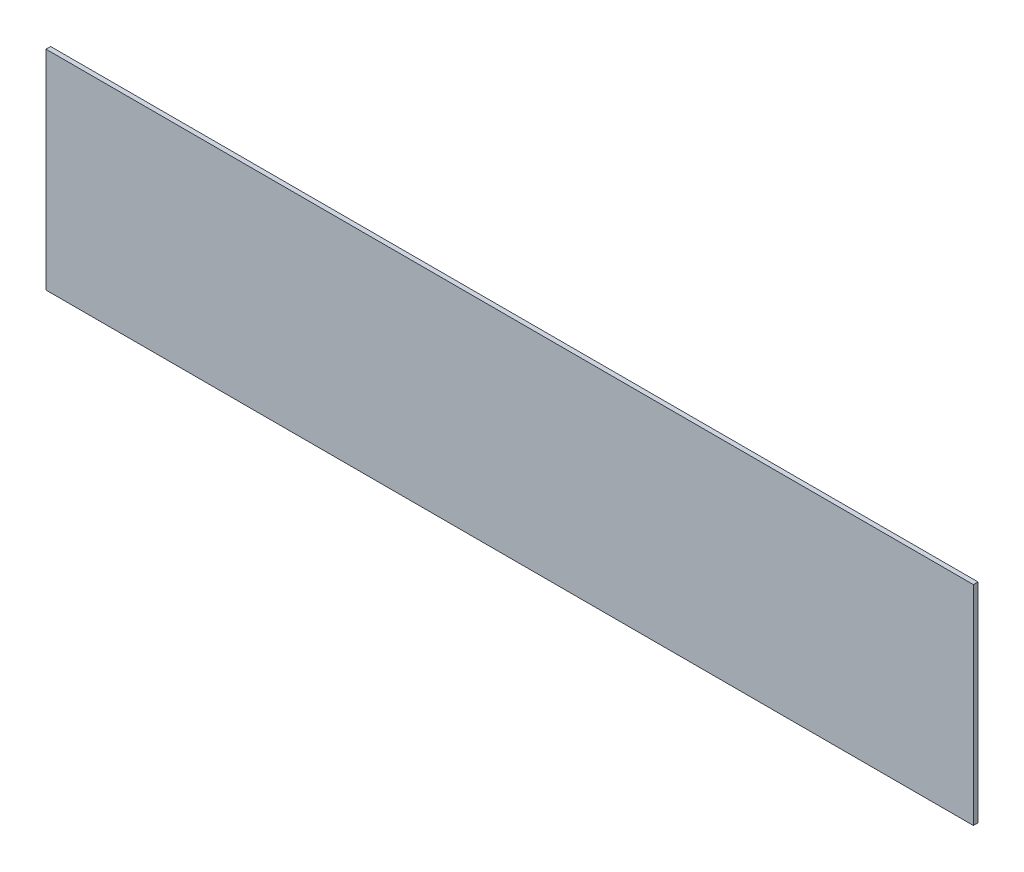
ISO-10303-21;
HEADER;
FILE_DESCRIPTION(('STEP AP214'),'2;1');
FILE_NAME('part.step','',(''),(''),'','','');
FILE_SCHEMA(('AUTOMOTIVE_DESIGN { 1 0 10303 214 1 1 1 1 }'));
ENDSEC;
DATA;
#1=APPLICATION_CONTEXT('core data for automotive mechanical design processes');
#2=APPLICATION_PROTOCOL_DEFINITION('international standard','automotive_design',2000,#1);
#3=PRODUCT_CONTEXT('',#1,'mechanical');
#4=PRODUCT('Part','Part','',(#3));
#5=PRODUCT_RELATED_PRODUCT_CATEGORY('part','',(#4));
#6=PRODUCT_DEFINITION_FORMATION('','',#4);
#7=PRODUCT_DEFINITION_CONTEXT('part definition',#1,'design');
#8=PRODUCT_DEFINITION('design','',#6,#7);
#9=PRODUCT_DEFINITION_SHAPE('','',#8);
#10=(LENGTH_UNIT() NAMED_UNIT(*) SI_UNIT(.MILLI.,.METRE.));
#11=(NAMED_UNIT(*) PLANE_ANGLE_UNIT() SI_UNIT($,.RADIAN.));
#12=(NAMED_UNIT(*) SI_UNIT($,.STERADIAN.) SOLID_ANGLE_UNIT());
#13=UNCERTAINTY_MEASURE_WITH_UNIT(LENGTH_MEASURE(1.E-05),#10,'distance_accuracy_value','');
#14=(GEOMETRIC_REPRESENTATION_CONTEXT(3) GLOBAL_UNCERTAINTY_ASSIGNED_CONTEXT((#13)) GLOBAL_UNIT_ASSIGNED_CONTEXT((#10,
#11,#12)) REPRESENTATION_CONTEXT('',''));
#15=CARTESIAN_POINT('',(0.,0.,0.));
#16=DIRECTION('',(0.,0.,1.));
#17=DIRECTION('',(1.,0.,0.));
#18=AXIS2_PLACEMENT_3D('',#15,#16,#17);
#19=CARTESIAN_POINT('',(400.,0.,0.));
#20=DIRECTION('',(0.,0.,-1.));
#21=DIRECTION('',(-1.,0.,0.));
#22=AXIS2_PLACEMENT_3D('',#19,#20,#21);
#23=PLANE('',#22);
#24=DIRECTION('',(0.,-1.,0.));
#25=VECTOR('',#24,1.);
#26=CARTESIAN_POINT('',(0.,0.,0.));
#27=LINE('',#26,#25);
#28=CARTESIAN_POINT('',(0.,90.,0.));
#29=VERTEX_POINT('',#28);
#30=CARTESIAN_POINT('',(0.,0.,0.));
#31=VERTEX_POINT('',#30);
#32=EDGE_CURVE('E96',#29,#31,#27,.T.);
#33=ORIENTED_EDGE('',*,*,#32,.T.);
#34=DIRECTION('',(-1.,0.,0.));
#35=VECTOR('',#34,1.);
#36=CARTESIAN_POINT('',(400.,0.,0.));
#37=LINE('',#36,#35);
#38=CARTESIAN_POINT('',(400.,0.,0.));
#39=VERTEX_POINT('',#38);
#40=EDGE_CURVE('E11',#39,#31,#37,.T.);
#41=ORIENTED_EDGE('',*,*,#40,.F.);
#42=DIRECTION('',(0.,-1.,0.));
#43=VECTOR('',#42,1.);
#44=CARTESIAN_POINT('',(400.,0.,0.));
#45=LINE('',#44,#43);
#46=CARTESIAN_POINT('',(400.,90.,0.));
#47=VERTEX_POINT('',#46);
#48=EDGE_CURVE('E84',#47,#39,#45,.T.);
#49=ORIENTED_EDGE('',*,*,#48,.F.);
#50=DIRECTION('',(-1.,0.,0.));
#51=VECTOR('',#50,1.);
#52=CARTESIAN_POINT('',(400.,90.,0.));
#53=LINE('',#52,#51);
#54=EDGE_CURVE('E92',#47,#29,#53,.T.);
#55=ORIENTED_EDGE('',*,*,#54,.T.);
#56=EDGE_LOOP('',(#33,#41,#49,#55));
#57=FACE_BOUND('',#56,.T.);
#58=ADVANCED_FACE('F33',(#57),#23,.F.);
#59=CARTESIAN_POINT('',(400.,0.,0.));
#60=DIRECTION('',(0.,1.,0.));
#61=DIRECTION('',(0.,0.,1.));
#62=AXIS2_PLACEMENT_3D('',#59,#60,#61);
#63=PLANE('',#62);
#64=DIRECTION('',(0.,0.,-1.));
#65=VECTOR('',#64,1.);
#66=CARTESIAN_POINT('',(0.,0.,0.));
#67=LINE('',#66,#65);
#68=CARTESIAN_POINT('',(0.,0.,-2.));
#69=VERTEX_POINT('',#68);
#70=EDGE_CURVE('E88',#31,#69,#67,.T.);
#71=ORIENTED_EDGE('',*,*,#70,.T.);
#72=DIRECTION('',(-1.,0.,0.));
#73=VECTOR('',#72,1.);
#74=CARTESIAN_POINT('',(400.,0.,-2.));
#75=LINE('',#74,#73);
#76=CARTESIAN_POINT('',(400.,0.,-2.));
#77=VERTEX_POINT('',#76);
#78=EDGE_CURVE('E41',#77,#69,#75,.T.);
#79=ORIENTED_EDGE('',*,*,#78,.F.);
#80=DIRECTION('',(0.,0.,-1.));
#81=VECTOR('',#80,1.);
#82=CARTESIAN_POINT('',(400.,0.,0.));
#83=LINE('',#82,#81);
#84=EDGE_CURVE('E79',#39,#77,#83,.T.);
#85=ORIENTED_EDGE('',*,*,#84,.F.);
#86=ORIENTED_EDGE('',*,*,#40,.T.);
#87=EDGE_LOOP('',(#71,#79,#85,#86));
#88=FACE_BOUND('',#87,.T.);
#89=ADVANCED_FACE('F87',(#88),#63,.F.);
#90=CARTESIAN_POINT('',(400.,0.,-2.));
#91=DIRECTION('',(0.,0.,1.));
#92=DIRECTION('',(1.,0.,0.));
#93=AXIS2_PLACEMENT_3D('',#90,#91,#92);
#94=PLANE('',#93);
#95=DIRECTION('',(0.,1.,0.));
#96=VECTOR('',#95,1.);
#97=CARTESIAN_POINT('',(0.,0.,-2.));
#98=LINE('',#97,#96);
#99=CARTESIAN_POINT('',(0.,90.,-2.));
#100=VERTEX_POINT('',#99);
#101=EDGE_CURVE('E66',#69,#100,#98,.T.);
#102=ORIENTED_EDGE('',*,*,#101,.T.);
#103=DIRECTION('',(-1.,0.,0.));
#104=VECTOR('',#103,1.);
#105=CARTESIAN_POINT('',(400.,90.,-2.));
#106=LINE('',#105,#104);
#107=CARTESIAN_POINT('',(400.,90.,-2.));
#108=VERTEX_POINT('',#107);
#109=EDGE_CURVE('E89',#108,#100,#106,.T.);
#110=ORIENTED_EDGE('',*,*,#109,.F.);
#111=DIRECTION('',(0.,1.,0.));
#112=VECTOR('',#111,1.);
#113=CARTESIAN_POINT('',(400.,0.,-2.));
#114=LINE('',#113,#112);
#115=EDGE_CURVE('E82',#77,#108,#114,.T.);
#116=ORIENTED_EDGE('',*,*,#115,.F.);
#117=ORIENTED_EDGE('',*,*,#78,.T.);
#118=EDGE_LOOP('',(#102,#110,#116,#117));
#119=FACE_BOUND('',#118,.T.);
#120=ADVANCED_FACE('F90',(#119),#94,.F.);
#121=CARTESIAN_POINT('',(400.,90.,0.));
#122=DIRECTION('',(0.,-1.,0.));
#123=DIRECTION('',(0.,0.,-1.));
#124=AXIS2_PLACEMENT_3D('',#121,#122,#123);
#125=PLANE('',#124);
#126=DIRECTION('',(0.,0.,1.));
#127=VECTOR('',#126,1.);
#128=CARTESIAN_POINT('',(0.,90.,0.));
#129=LINE('',#128,#127);
#130=EDGE_CURVE('E72',#100,#29,#129,.T.);
#131=ORIENTED_EDGE('',*,*,#130,.T.);
#132=ORIENTED_EDGE('',*,*,#54,.F.);
#133=DIRECTION('',(0.,0.,1.));
#134=VECTOR('',#133,1.);
#135=CARTESIAN_POINT('',(400.,90.,0.));
#136=LINE('',#135,#134);
#137=EDGE_CURVE('E49',#108,#47,#136,.T.);
#138=ORIENTED_EDGE('',*,*,#137,.F.);
#139=ORIENTED_EDGE('',*,*,#109,.T.);
#140=EDGE_LOOP('',(#131,#132,#138,#139));
#141=FACE_BOUND('',#140,.T.);
#142=ADVANCED_FACE('F103',(#141),#125,.F.);
#143=CARTESIAN_POINT('',(400.,0.,0.));
#144=DIRECTION('',(-1.,0.,0.));
#145=DIRECTION('',(0.,0.,1.));
#146=AXIS2_PLACEMENT_3D('',#143,#144,#145);
#147=PLANE('',#146);
#148=ORIENTED_EDGE('',*,*,#48,.T.);
#149=ORIENTED_EDGE('',*,*,#84,.T.);
#150=ORIENTED_EDGE('',*,*,#115,.T.);
#151=ORIENTED_EDGE('',*,*,#137,.T.);
#152=EDGE_LOOP('',(#148,#149,#150,#151));
#153=FACE_BOUND('',#152,.T.);
#154=ADVANCED_FACE('F80',(#153),#147,.F.);
#155=CARTESIAN_POINT('',(0.,0.,0.));
#156=DIRECTION('',(-1.,0.,0.));
#157=DIRECTION('',(0.,0.,1.));
#158=AXIS2_PLACEMENT_3D('',#155,#156,#157);
#159=PLANE('',#158);
#160=ORIENTED_EDGE('',*,*,#32,.F.);
#161=ORIENTED_EDGE('',*,*,#130,.F.);
#162=ORIENTED_EDGE('',*,*,#101,.F.);
#163=ORIENTED_EDGE('',*,*,#70,.F.);
#164=EDGE_LOOP('',(#160,#161,#162,#163));
#165=FACE_BOUND('',#164,.T.);
#166=ADVANCED_FACE('F106',(#165),#159,.T.);
#167=CLOSED_SHELL('',(#58,#89,#120,#142,#154,#166));
#168=MANIFOLD_SOLID_BREP('B2',#167);
#169=ADVANCED_BREP_SHAPE_REPRESENTATION('',(#18,#168),#14);
#170=SHAPE_DEFINITION_REPRESENTATION(#9,#169);
ENDSEC;
END-ISO-10303-21;
